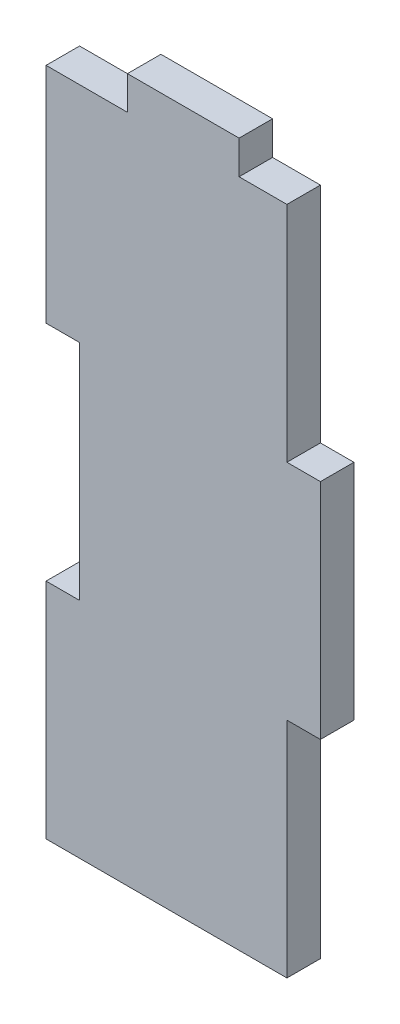
ISO-10303-21;
HEADER;
FILE_DESCRIPTION(('STEP AP214'),'2;1');
FILE_NAME('part.step','',(''),(''),'','','');
FILE_SCHEMA(('AUTOMOTIVE_DESIGN { 1 0 10303 214 1 1 1 1 }'));
ENDSEC;
DATA;
#1=APPLICATION_CONTEXT('core data for automotive mechanical design processes');
#2=APPLICATION_PROTOCOL_DEFINITION('international standard','automotive_design',2000,#1);
#3=PRODUCT_CONTEXT('',#1,'mechanical');
#4=PRODUCT('Part','Part','',(#3));
#5=PRODUCT_RELATED_PRODUCT_CATEGORY('part','',(#4));
#6=PRODUCT_DEFINITION_FORMATION('','',#4);
#7=PRODUCT_DEFINITION_CONTEXT('part definition',#1,'design');
#8=PRODUCT_DEFINITION('design','',#6,#7);
#9=PRODUCT_DEFINITION_SHAPE('','',#8);
#10=(LENGTH_UNIT() NAMED_UNIT(*) SI_UNIT(.MILLI.,.METRE.));
#11=(NAMED_UNIT(*) PLANE_ANGLE_UNIT() SI_UNIT($,.RADIAN.));
#12=(NAMED_UNIT(*) SI_UNIT($,.STERADIAN.) SOLID_ANGLE_UNIT());
#13=UNCERTAINTY_MEASURE_WITH_UNIT(LENGTH_MEASURE(1.E-05),#10,'distance_accuracy_value','');
#14=(GEOMETRIC_REPRESENTATION_CONTEXT(3) GLOBAL_UNCERTAINTY_ASSIGNED_CONTEXT((#13)) GLOBAL_UNIT_ASSIGNED_CONTEXT((#10,
#11,#12)) REPRESENTATION_CONTEXT('',''));
#15=CARTESIAN_POINT('',(0.,0.,0.));
#16=DIRECTION('',(0.,0.,1.));
#17=DIRECTION('',(1.,0.,0.));
#18=AXIS2_PLACEMENT_3D('',#15,#16,#17);
#19=CARTESIAN_POINT('',(13.785,60.,3.));
#20=DIRECTION('',(0.,-1.,0.));
#21=DIRECTION('',(0.,0.,-1.));
#22=AXIS2_PLACEMENT_3D('',#19,#20,#21);
#23=PLANE('',#22);
#24=DIRECTION('',(0.,0.,1.));
#25=VECTOR('',#24,1.);
#26=CARTESIAN_POINT('',(17.285,60.,-4.60977222864645));
#27=LINE('',#26,#25);
#28=CARTESIAN_POINT('',(17.285,60.,0.));
#29=VERTEX_POINT('',#28);
#30=CARTESIAN_POINT('',(17.285,60.,3.));
#31=VERTEX_POINT('',#30);
#32=EDGE_CURVE('E69',#29,#31,#27,.T.);
#33=ORIENTED_EDGE('',*,*,#32,.T.);
#34=DIRECTION('',(-1.,0.,0.));
#35=VECTOR('',#34,1.);
#36=CARTESIAN_POINT('',(13.785,60.,3.));
#37=LINE('',#36,#35);
#38=CARTESIAN_POINT('',(21.57,60.,3.));
#39=VERTEX_POINT('',#38);
#40=EDGE_CURVE('E171',#39,#31,#37,.T.);
#41=ORIENTED_EDGE('',*,*,#40,.F.);
#42=DIRECTION('',(0.,0.,-1.));
#43=VECTOR('',#42,1.);
#44=CARTESIAN_POINT('',(21.57,60.,3.));
#45=LINE('',#44,#43);
#46=CARTESIAN_POINT('',(21.57,60.,0.));
#47=VERTEX_POINT('',#46);
#48=EDGE_CURVE('E311',#39,#47,#45,.T.);
#49=ORIENTED_EDGE('',*,*,#48,.T.);
#50=DIRECTION('',(-1.,0.,0.));
#51=VECTOR('',#50,1.);
#52=CARTESIAN_POINT('',(13.785,60.,0.));
#53=LINE('',#52,#51);
#54=EDGE_CURVE('E259',#47,#29,#53,.T.);
#55=ORIENTED_EDGE('',*,*,#54,.T.);
#56=EDGE_LOOP('',(#33,#41,#49,#55));
#57=FACE_BOUND('',#56,.T.);
#58=ADVANCED_FACE('F45',(#57),#23,.F.);
#59=CARTESIAN_POINT('',(21.57,20.,3.));
#60=DIRECTION('',(-1.,0.,0.));
#61=DIRECTION('',(0.,0.,1.));
#62=AXIS2_PLACEMENT_3D('',#59,#60,#61);
#63=PLANE('',#62);
#64=DIRECTION('',(0.,1.,0.));
#65=VECTOR('',#64,1.);
#66=CARTESIAN_POINT('',(21.57,20.,0.));
#67=LINE('',#66,#65);
#68=CARTESIAN_POINT('',(21.57,0.,0.));
#69=VERTEX_POINT('',#68);
#70=CARTESIAN_POINT('',(21.57,20.,0.));
#71=VERTEX_POINT('',#70);
#72=EDGE_CURVE('E181',#69,#71,#67,.T.);
#73=ORIENTED_EDGE('',*,*,#72,.T.);
#74=DIRECTION('',(0.,0.,-1.));
#75=VECTOR('',#74,1.);
#76=CARTESIAN_POINT('',(21.57,20.,3.));
#77=LINE('',#76,#75);
#78=CARTESIAN_POINT('',(21.57,20.,3.));
#79=VERTEX_POINT('',#78);
#80=EDGE_CURVE('E11',#79,#71,#77,.T.);
#81=ORIENTED_EDGE('',*,*,#80,.F.);
#82=DIRECTION('',(0.,1.,0.));
#83=VECTOR('',#82,1.);
#84=CARTESIAN_POINT('',(21.57,20.,3.));
#85=LINE('',#84,#83);
#86=CARTESIAN_POINT('',(21.57,0.,3.));
#87=VERTEX_POINT('',#86);
#88=EDGE_CURVE('E204',#87,#79,#85,.T.);
#89=ORIENTED_EDGE('',*,*,#88,.F.);
#90=DIRECTION('',(0.,0.,-1.));
#91=VECTOR('',#90,1.);
#92=CARTESIAN_POINT('',(21.57,0.,3.));
#93=LINE('',#92,#91);
#94=EDGE_CURVE('E243',#87,#69,#93,.T.);
#95=ORIENTED_EDGE('',*,*,#94,.T.);
#96=EDGE_LOOP('',(#73,#81,#89,#95));
#97=FACE_BOUND('',#96,.T.);
#98=ADVANCED_FACE('F47',(#97),#63,.F.);
#99=CARTESIAN_POINT('',(24.57,20.,3.));
#100=DIRECTION('',(0.,1.,0.));
#101=DIRECTION('',(0.,0.,1.));
#102=AXIS2_PLACEMENT_3D('',#99,#100,#101);
#103=PLANE('',#102);
#104=DIRECTION('',(1.,0.,0.));
#105=VECTOR('',#104,1.);
#106=CARTESIAN_POINT('',(24.57,20.,0.));
#107=LINE('',#106,#105);
#108=CARTESIAN_POINT('',(24.57,20.,0.));
#109=VERTEX_POINT('',#108);
#110=EDGE_CURVE('E247',#71,#109,#107,.T.);
#111=ORIENTED_EDGE('',*,*,#110,.T.);
#112=DIRECTION('',(0.,0.,-1.));
#113=VECTOR('',#112,1.);
#114=CARTESIAN_POINT('',(24.57,20.,3.));
#115=LINE('',#114,#113);
#116=CARTESIAN_POINT('',(24.57,20.,3.));
#117=VERTEX_POINT('',#116);
#118=EDGE_CURVE('E54',#117,#109,#115,.T.);
#119=ORIENTED_EDGE('',*,*,#118,.F.);
#120=DIRECTION('',(1.,0.,0.));
#121=VECTOR('',#120,1.);
#122=CARTESIAN_POINT('',(24.57,20.,3.));
#123=LINE('',#122,#121);
#124=EDGE_CURVE('E208',#79,#117,#123,.T.);
#125=ORIENTED_EDGE('',*,*,#124,.F.);
#126=ORIENTED_EDGE('',*,*,#80,.T.);
#127=EDGE_LOOP('',(#111,#119,#125,#126));
#128=FACE_BOUND('',#127,.T.);
#129=ADVANCED_FACE('F348',(#128),#103,.F.);
#130=CARTESIAN_POINT('',(24.57,40.,3.));
#131=DIRECTION('',(-1.,0.,0.));
#132=DIRECTION('',(0.,0.,1.));
#133=AXIS2_PLACEMENT_3D('',#130,#131,#132);
#134=PLANE('',#133);
#135=DIRECTION('',(0.,1.,0.));
#136=VECTOR('',#135,1.);
#137=CARTESIAN_POINT('',(24.57,40.,0.));
#138=LINE('',#137,#136);
#139=CARTESIAN_POINT('',(24.57,40.,0.));
#140=VERTEX_POINT('',#139);
#141=EDGE_CURVE('E250',#109,#140,#138,.T.);
#142=ORIENTED_EDGE('',*,*,#141,.T.);
#143=DIRECTION('',(0.,0.,-1.));
#144=VECTOR('',#143,1.);
#145=CARTESIAN_POINT('',(24.57,40.,3.));
#146=LINE('',#145,#144);
#147=CARTESIAN_POINT('',(24.57,40.,3.));
#148=VERTEX_POINT('',#147);
#149=EDGE_CURVE('E319',#148,#140,#146,.T.);
#150=ORIENTED_EDGE('',*,*,#149,.F.);
#151=DIRECTION('',(0.,1.,0.));
#152=VECTOR('',#151,1.);
#153=CARTESIAN_POINT('',(24.57,40.,3.));
#154=LINE('',#153,#152);
#155=EDGE_CURVE('E212',#117,#148,#154,.T.);
#156=ORIENTED_EDGE('',*,*,#155,.F.);
#157=ORIENTED_EDGE('',*,*,#118,.T.);
#158=EDGE_LOOP('',(#142,#150,#156,#157));
#159=FACE_BOUND('',#158,.T.);
#160=ADVANCED_FACE('F328',(#159),#134,.F.);
#161=CARTESIAN_POINT('',(21.57,40.,3.));
#162=DIRECTION('',(0.,-1.,0.));
#163=DIRECTION('',(0.,0.,-1.));
#164=AXIS2_PLACEMENT_3D('',#161,#162,#163);
#165=PLANE('',#164);
#166=DIRECTION('',(-1.,0.,0.));
#167=VECTOR('',#166,1.);
#168=CARTESIAN_POINT('',(21.57,40.,0.));
#169=LINE('',#168,#167);
#170=CARTESIAN_POINT('',(21.57,40.,0.));
#171=VERTEX_POINT('',#170);
#172=EDGE_CURVE('E253',#140,#171,#169,.T.);
#173=ORIENTED_EDGE('',*,*,#172,.T.);
#174=DIRECTION('',(0.,0.,-1.));
#175=VECTOR('',#174,1.);
#176=CARTESIAN_POINT('',(21.57,40.,3.));
#177=LINE('',#176,#175);
#178=CARTESIAN_POINT('',(21.57,40.,3.));
#179=VERTEX_POINT('',#178);
#180=EDGE_CURVE('E315',#179,#171,#177,.T.);
#181=ORIENTED_EDGE('',*,*,#180,.F.);
#182=DIRECTION('',(-1.,0.,0.));
#183=VECTOR('',#182,1.);
#184=CARTESIAN_POINT('',(21.57,40.,3.));
#185=LINE('',#184,#183);
#186=EDGE_CURVE('E215',#148,#179,#185,.T.);
#187=ORIENTED_EDGE('',*,*,#186,.F.);
#188=ORIENTED_EDGE('',*,*,#149,.T.);
#189=EDGE_LOOP('',(#173,#181,#187,#188));
#190=FACE_BOUND('',#189,.T.);
#191=ADVANCED_FACE('F340',(#190),#165,.F.);
#192=CARTESIAN_POINT('',(21.57,60.,3.));
#193=DIRECTION('',(-1.,0.,0.));
#194=DIRECTION('',(0.,0.,1.));
#195=AXIS2_PLACEMENT_3D('',#192,#193,#194);
#196=PLANE('',#195);
#197=DIRECTION('',(0.,1.,0.));
#198=VECTOR('',#197,1.);
#199=CARTESIAN_POINT('',(21.57,60.,0.));
#200=LINE('',#199,#198);
#201=EDGE_CURVE('E256',#171,#47,#200,.T.);
#202=ORIENTED_EDGE('',*,*,#201,.T.);
#203=ORIENTED_EDGE('',*,*,#48,.F.);
#204=DIRECTION('',(0.,1.,0.));
#205=VECTOR('',#204,1.);
#206=CARTESIAN_POINT('',(21.57,60.,3.));
#207=LINE('',#206,#205);
#208=EDGE_CURVE('E218',#179,#39,#207,.T.);
#209=ORIENTED_EDGE('',*,*,#208,.F.);
#210=ORIENTED_EDGE('',*,*,#180,.T.);
#211=EDGE_LOOP('',(#202,#203,#209,#210));
#212=FACE_BOUND('',#211,.T.);
#213=ADVANCED_FACE('F344',(#212),#196,.F.);
#214=CARTESIAN_POINT('',(10.785,63.,3.));
#215=DIRECTION('',(0.,-1.,0.));
#216=DIRECTION('',(0.,0.,-1.));
#217=AXIS2_PLACEMENT_3D('',#214,#215,#216);
#218=PLANE('',#217);
#219=DIRECTION('',(-1.,0.,0.));
#220=VECTOR('',#219,1.);
#221=CARTESIAN_POINT('',(10.785,63.,0.));
#222=LINE('',#221,#220);
#223=CARTESIAN_POINT('',(17.285,63.,0.));
#224=VERTEX_POINT('',#223);
#225=CARTESIAN_POINT('',(7.285,63.,0.));
#226=VERTEX_POINT('',#225);
#227=EDGE_CURVE('E176',#224,#226,#222,.T.);
#228=ORIENTED_EDGE('',*,*,#227,.T.);
#229=DIRECTION('',(0.,0.,1.));
#230=VECTOR('',#229,1.);
#231=CARTESIAN_POINT('',(7.285,63.,-4.60977222864645));
#232=LINE('',#231,#230);
#233=CARTESIAN_POINT('',(7.285,63.,3.));
#234=VERTEX_POINT('',#233);
#235=EDGE_CURVE('E174',#226,#234,#232,.T.);
#236=ORIENTED_EDGE('',*,*,#235,.T.);
#237=DIRECTION('',(-1.,0.,0.));
#238=VECTOR('',#237,1.);
#239=CARTESIAN_POINT('',(10.785,63.,3.));
#240=LINE('',#239,#238);
#241=CARTESIAN_POINT('',(17.285,63.,3.));
#242=VERTEX_POINT('',#241);
#243=EDGE_CURVE('E160',#242,#234,#240,.T.);
#244=ORIENTED_EDGE('',*,*,#243,.F.);
#245=DIRECTION('',(0.,0.,1.));
#246=VECTOR('',#245,1.);
#247=CARTESIAN_POINT('',(17.285,63.,-4.60977222864645));
#248=LINE('',#247,#246);
#249=EDGE_CURVE('E198',#224,#242,#248,.T.);
#250=ORIENTED_EDGE('',*,*,#249,.F.);
#251=EDGE_LOOP('',(#228,#236,#244,#250));
#252=FACE_BOUND('',#251,.T.);
#253=ADVANCED_FACE('F175',(#252),#218,.F.);
#254=CARTESIAN_POINT('',(0.,60.,3.));
#255=DIRECTION('',(0.,-1.,0.));
#256=DIRECTION('',(0.,0.,-1.));
#257=AXIS2_PLACEMENT_3D('',#254,#255,#256);
#258=PLANE('',#257);
#259=DIRECTION('',(-1.,0.,0.));
#260=VECTOR('',#259,1.);
#261=CARTESIAN_POINT('',(0.,60.,3.));
#262=LINE('',#261,#260);
#263=CARTESIAN_POINT('',(7.285,60.,3.));
#264=VERTEX_POINT('',#263);
#265=CARTESIAN_POINT('',(0.,60.,3.));
#266=VERTEX_POINT('',#265);
#267=EDGE_CURVE('E61',#264,#266,#262,.T.);
#268=ORIENTED_EDGE('',*,*,#267,.F.);
#269=DIRECTION('',(0.,0.,1.));
#270=VECTOR('',#269,1.);
#271=CARTESIAN_POINT('',(7.285,60.,-4.60977222864645));
#272=LINE('',#271,#270);
#273=CARTESIAN_POINT('',(7.285,60.,0.));
#274=VERTEX_POINT('',#273);
#275=EDGE_CURVE('E182',#274,#264,#272,.T.);
#276=ORIENTED_EDGE('',*,*,#275,.F.);
#277=DIRECTION('',(-1.,0.,0.));
#278=VECTOR('',#277,1.);
#279=CARTESIAN_POINT('',(0.,60.,0.));
#280=LINE('',#279,#278);
#281=CARTESIAN_POINT('',(0.,60.,0.));
#282=VERTEX_POINT('',#281);
#283=EDGE_CURVE('E264',#274,#282,#280,.T.);
#284=ORIENTED_EDGE('',*,*,#283,.T.);
#285=DIRECTION('',(0.,0.,-1.));
#286=VECTOR('',#285,1.);
#287=CARTESIAN_POINT('',(0.,60.,3.));
#288=LINE('',#287,#286);
#289=EDGE_CURVE('E307',#266,#282,#288,.T.);
#290=ORIENTED_EDGE('',*,*,#289,.F.);
#291=EDGE_LOOP('',(#268,#276,#284,#290));
#292=FACE_BOUND('',#291,.T.);
#293=ADVANCED_FACE('F380',(#292),#258,.F.);
#294=CARTESIAN_POINT('',(0.,40.,3.));
#295=DIRECTION('',(1.,0.,0.));
#296=DIRECTION('',(0.,0.,-1.));
#297=AXIS2_PLACEMENT_3D('',#294,#295,#296);
#298=PLANE('',#297);
#299=DIRECTION('',(0.,-1.,0.));
#300=VECTOR('',#299,1.);
#301=CARTESIAN_POINT('',(0.,40.,0.));
#302=LINE('',#301,#300);
#303=CARTESIAN_POINT('',(0.,40.,0.));
#304=VERTEX_POINT('',#303);
#305=EDGE_CURVE('E267',#282,#304,#302,.T.);
#306=ORIENTED_EDGE('',*,*,#305,.T.);
#307=DIRECTION('',(0.,0.,-1.));
#308=VECTOR('',#307,1.);
#309=CARTESIAN_POINT('',(0.,40.,3.));
#310=LINE('',#309,#308);
#311=CARTESIAN_POINT('',(0.,40.,3.));
#312=VERTEX_POINT('',#311);
#313=EDGE_CURVE('E303',#312,#304,#310,.T.);
#314=ORIENTED_EDGE('',*,*,#313,.F.);
#315=DIRECTION('',(0.,-1.,0.));
#316=VECTOR('',#315,1.);
#317=CARTESIAN_POINT('',(0.,40.,3.));
#318=LINE('',#317,#316);
#319=EDGE_CURVE('E225',#266,#312,#318,.T.);
#320=ORIENTED_EDGE('',*,*,#319,.F.);
#321=ORIENTED_EDGE('',*,*,#289,.T.);
#322=EDGE_LOOP('',(#306,#314,#320,#321));
#323=FACE_BOUND('',#322,.T.);
#324=ADVANCED_FACE('F379',(#323),#298,.F.);
#325=CARTESIAN_POINT('',(3.,40.,3.));
#326=DIRECTION('',(0.,1.,0.));
#327=DIRECTION('',(0.,0.,1.));
#328=AXIS2_PLACEMENT_3D('',#325,#326,#327);
#329=PLANE('',#328);
#330=DIRECTION('',(1.,0.,0.));
#331=VECTOR('',#330,1.);
#332=CARTESIAN_POINT('',(3.,40.,0.));
#333=LINE('',#332,#331);
#334=CARTESIAN_POINT('',(3.,40.,0.));
#335=VERTEX_POINT('',#334);
#336=EDGE_CURVE('E270',#304,#335,#333,.T.);
#337=ORIENTED_EDGE('',*,*,#336,.T.);
#338=DIRECTION('',(0.,0.,-1.));
#339=VECTOR('',#338,1.);
#340=CARTESIAN_POINT('',(3.,40.,3.));
#341=LINE('',#340,#339);
#342=CARTESIAN_POINT('',(3.,40.,3.));
#343=VERTEX_POINT('',#342);
#344=EDGE_CURVE('E299',#343,#335,#341,.T.);
#345=ORIENTED_EDGE('',*,*,#344,.F.);
#346=DIRECTION('',(1.,0.,0.));
#347=VECTOR('',#346,1.);
#348=CARTESIAN_POINT('',(3.,40.,3.));
#349=LINE('',#348,#347);
#350=EDGE_CURVE('E228',#312,#343,#349,.T.);
#351=ORIENTED_EDGE('',*,*,#350,.F.);
#352=ORIENTED_EDGE('',*,*,#313,.T.);
#353=EDGE_LOOP('',(#337,#345,#351,#352));
#354=FACE_BOUND('',#353,.T.);
#355=ADVANCED_FACE('F375',(#354),#329,.F.);
#356=CARTESIAN_POINT('',(3.,20.,3.));
#357=DIRECTION('',(1.,0.,0.));
#358=DIRECTION('',(0.,0.,-1.));
#359=AXIS2_PLACEMENT_3D('',#356,#357,#358);
#360=PLANE('',#359);
#361=DIRECTION('',(0.,-1.,0.));
#362=VECTOR('',#361,1.);
#363=CARTESIAN_POINT('',(3.,20.,0.));
#364=LINE('',#363,#362);
#365=CARTESIAN_POINT('',(3.,20.,0.));
#366=VERTEX_POINT('',#365);
#367=EDGE_CURVE('E273',#335,#366,#364,.T.);
#368=ORIENTED_EDGE('',*,*,#367,.T.);
#369=DIRECTION('',(0.,0.,-1.));
#370=VECTOR('',#369,1.);
#371=CARTESIAN_POINT('',(3.,20.,3.));
#372=LINE('',#371,#370);
#373=CARTESIAN_POINT('',(3.,20.,3.));
#374=VERTEX_POINT('',#373);
#375=EDGE_CURVE('E295',#374,#366,#372,.T.);
#376=ORIENTED_EDGE('',*,*,#375,.F.);
#377=DIRECTION('',(0.,-1.,0.));
#378=VECTOR('',#377,1.);
#379=CARTESIAN_POINT('',(3.,20.,3.));
#380=LINE('',#379,#378);
#381=EDGE_CURVE('E231',#343,#374,#380,.T.);
#382=ORIENTED_EDGE('',*,*,#381,.F.);
#383=ORIENTED_EDGE('',*,*,#344,.T.);
#384=EDGE_LOOP('',(#368,#376,#382,#383));
#385=FACE_BOUND('',#384,.T.);
#386=ADVANCED_FACE('F370',(#385),#360,.F.);
#387=CARTESIAN_POINT('',(0.,20.,3.));
#388=DIRECTION('',(0.,-1.,0.));
#389=DIRECTION('',(0.,0.,-1.));
#390=AXIS2_PLACEMENT_3D('',#387,#388,#389);
#391=PLANE('',#390);
#392=DIRECTION('',(-1.,0.,0.));
#393=VECTOR('',#392,1.);
#394=CARTESIAN_POINT('',(0.,20.,0.));
#395=LINE('',#394,#393);
#396=CARTESIAN_POINT('',(0.,20.,0.));
#397=VERTEX_POINT('',#396);
#398=EDGE_CURVE('E276',#366,#397,#395,.T.);
#399=ORIENTED_EDGE('',*,*,#398,.T.);
#400=DIRECTION('',(0.,0.,-1.));
#401=VECTOR('',#400,1.);
#402=CARTESIAN_POINT('',(0.,20.,3.));
#403=LINE('',#402,#401);
#404=CARTESIAN_POINT('',(0.,20.,3.));
#405=VERTEX_POINT('',#404);
#406=EDGE_CURVE('E291',#405,#397,#403,.T.);
#407=ORIENTED_EDGE('',*,*,#406,.F.);
#408=DIRECTION('',(-1.,0.,0.));
#409=VECTOR('',#408,1.);
#410=CARTESIAN_POINT('',(0.,20.,3.));
#411=LINE('',#410,#409);
#412=EDGE_CURVE('E234',#374,#405,#411,.T.);
#413=ORIENTED_EDGE('',*,*,#412,.F.);
#414=ORIENTED_EDGE('',*,*,#375,.T.);
#415=EDGE_LOOP('',(#399,#407,#413,#414));
#416=FACE_BOUND('',#415,.T.);
#417=ADVANCED_FACE('F364',(#416),#391,.F.);
#418=CARTESIAN_POINT('',(0.,0.,3.));
#419=DIRECTION('',(1.,0.,0.));
#420=DIRECTION('',(0.,0.,-1.));
#421=AXIS2_PLACEMENT_3D('',#418,#419,#420);
#422=PLANE('',#421);
#423=DIRECTION('',(0.,-1.,0.));
#424=VECTOR('',#423,1.);
#425=CARTESIAN_POINT('',(0.,0.,0.));
#426=LINE('',#425,#424);
#427=CARTESIAN_POINT('',(0.,0.,0.));
#428=VERTEX_POINT('',#427);
#429=EDGE_CURVE('E279',#397,#428,#426,.T.);
#430=ORIENTED_EDGE('',*,*,#429,.T.);
#431=DIRECTION('',(0.,0.,-1.));
#432=VECTOR('',#431,1.);
#433=CARTESIAN_POINT('',(0.,0.,3.));
#434=LINE('',#433,#432);
#435=CARTESIAN_POINT('',(0.,0.,3.));
#436=VERTEX_POINT('',#435);
#437=EDGE_CURVE('E287',#436,#428,#434,.T.);
#438=ORIENTED_EDGE('',*,*,#437,.F.);
#439=DIRECTION('',(0.,-1.,0.));
#440=VECTOR('',#439,1.);
#441=CARTESIAN_POINT('',(0.,0.,3.));
#442=LINE('',#441,#440);
#443=EDGE_CURVE('E237',#405,#436,#442,.T.);
#444=ORIENTED_EDGE('',*,*,#443,.F.);
#445=ORIENTED_EDGE('',*,*,#406,.T.);
#446=EDGE_LOOP('',(#430,#438,#444,#445));
#447=FACE_BOUND('',#446,.T.);
#448=ADVANCED_FACE('F360',(#447),#422,.F.);
#449=CARTESIAN_POINT('',(21.57,0.,3.));
#450=DIRECTION('',(0.,1.,0.));
#451=DIRECTION('',(0.,0.,1.));
#452=AXIS2_PLACEMENT_3D('',#449,#450,#451);
#453=PLANE('',#452);
#454=DIRECTION('',(1.,0.,0.));
#455=VECTOR('',#454,1.);
#456=CARTESIAN_POINT('',(21.57,0.,0.));
#457=LINE('',#456,#455);
#458=EDGE_CURVE('E209',#428,#69,#457,.T.);
#459=ORIENTED_EDGE('',*,*,#458,.T.);
#460=ORIENTED_EDGE('',*,*,#94,.F.);
#461=DIRECTION('',(1.,0.,0.));
#462=VECTOR('',#461,1.);
#463=CARTESIAN_POINT('',(21.57,0.,3.));
#464=LINE('',#463,#462);
#465=EDGE_CURVE('E240',#436,#87,#464,.T.);
#466=ORIENTED_EDGE('',*,*,#465,.F.);
#467=ORIENTED_EDGE('',*,*,#437,.T.);
#468=EDGE_LOOP('',(#459,#460,#466,#467));
#469=FACE_BOUND('',#468,.T.);
#470=ADVANCED_FACE('F355',(#469),#453,.F.);
#471=CARTESIAN_POINT('',(0.,0.,3.));
#472=DIRECTION('',(0.,0.,-1.));
#473=DIRECTION('',(-1.,0.,0.));
#474=AXIS2_PLACEMENT_3D('',#471,#472,#473);
#475=PLANE('',#474);
#476=DIRECTION('',(0.,-1.,0.));
#477=VECTOR('',#476,1.);
#478=CARTESIAN_POINT('',(7.285,0.,3.));
#479=LINE('',#478,#477);
#480=EDGE_CURVE('E164',#234,#264,#479,.T.);
#481=ORIENTED_EDGE('',*,*,#480,.T.);
#482=ORIENTED_EDGE('',*,*,#267,.T.);
#483=ORIENTED_EDGE('',*,*,#319,.T.);
#484=ORIENTED_EDGE('',*,*,#350,.T.);
#485=ORIENTED_EDGE('',*,*,#381,.T.);
#486=ORIENTED_EDGE('',*,*,#412,.T.);
#487=ORIENTED_EDGE('',*,*,#443,.T.);
#488=ORIENTED_EDGE('',*,*,#465,.T.);
#489=ORIENTED_EDGE('',*,*,#88,.T.);
#490=ORIENTED_EDGE('',*,*,#124,.T.);
#491=ORIENTED_EDGE('',*,*,#155,.T.);
#492=ORIENTED_EDGE('',*,*,#186,.T.);
#493=ORIENTED_EDGE('',*,*,#208,.T.);
#494=ORIENTED_EDGE('',*,*,#40,.T.);
#495=DIRECTION('',(0.,-1.,0.));
#496=VECTOR('',#495,1.);
#497=CARTESIAN_POINT('',(17.285,0.,3.));
#498=LINE('',#497,#496);
#499=EDGE_CURVE('E166',#242,#31,#498,.T.);
#500=ORIENTED_EDGE('',*,*,#499,.F.);
#501=ORIENTED_EDGE('',*,*,#243,.T.);
#502=EDGE_LOOP('',(#481,#482,#483,#484,#485,#486,#487,#488,#489,#490,#491,#492,#493,#494,#500,#501));
#503=FACE_BOUND('',#502,.T.);
#504=ADVANCED_FACE('F162',(#503),#475,.F.);
#505=CARTESIAN_POINT('',(0.,0.,0.));
#506=DIRECTION('',(0.,0.,-1.));
#507=DIRECTION('',(-1.,0.,0.));
#508=AXIS2_PLACEMENT_3D('',#505,#506,#507);
#509=PLANE('',#508);
#510=ORIENTED_EDGE('',*,*,#283,.F.);
#511=DIRECTION('',(0.,-1.,0.));
#512=VECTOR('',#511,1.);
#513=CARTESIAN_POINT('',(7.285,0.,0.));
#514=LINE('',#513,#512);
#515=EDGE_CURVE('E186',#226,#274,#514,.T.);
#516=ORIENTED_EDGE('',*,*,#515,.F.);
#517=ORIENTED_EDGE('',*,*,#227,.F.);
#518=DIRECTION('',(0.,-1.,0.));
#519=VECTOR('',#518,1.);
#520=CARTESIAN_POINT('',(17.285,0.,0.));
#521=LINE('',#520,#519);
#522=EDGE_CURVE('E187',#224,#29,#521,.T.);
#523=ORIENTED_EDGE('',*,*,#522,.T.);
#524=ORIENTED_EDGE('',*,*,#54,.F.);
#525=ORIENTED_EDGE('',*,*,#201,.F.);
#526=ORIENTED_EDGE('',*,*,#172,.F.);
#527=ORIENTED_EDGE('',*,*,#141,.F.);
#528=ORIENTED_EDGE('',*,*,#110,.F.);
#529=ORIENTED_EDGE('',*,*,#72,.F.);
#530=ORIENTED_EDGE('',*,*,#458,.F.);
#531=ORIENTED_EDGE('',*,*,#429,.F.);
#532=ORIENTED_EDGE('',*,*,#398,.F.);
#533=ORIENTED_EDGE('',*,*,#367,.F.);
#534=ORIENTED_EDGE('',*,*,#336,.F.);
#535=ORIENTED_EDGE('',*,*,#305,.F.);
#536=EDGE_LOOP('',(#510,#516,#517,#523,#524,#525,#526,#527,#528,#529,#530,#531,#532,#533,#534,#535));
#537=FACE_BOUND('',#536,.T.);
#538=ADVANCED_FACE('F334',(#537),#509,.T.);
#539=CARTESIAN_POINT('',(17.285,0.,-4.60977222864645));
#540=DIRECTION('',(-1.,0.,0.));
#541=DIRECTION('',(0.,0.,1.));
#542=AXIS2_PLACEMENT_3D('',#539,#540,#541);
#543=PLANE('',#542);
#544=ORIENTED_EDGE('',*,*,#522,.F.);
#545=ORIENTED_EDGE('',*,*,#249,.T.);
#546=ORIENTED_EDGE('',*,*,#499,.T.);
#547=ORIENTED_EDGE('',*,*,#32,.F.);
#548=EDGE_LOOP('',(#544,#545,#546,#547));
#549=FACE_BOUND('',#548,.T.);
#550=ADVANCED_FACE('F484',(#549),#543,.F.);
#551=CARTESIAN_POINT('',(7.285,0.,-4.60977222864645));
#552=DIRECTION('',(-1.,0.,0.));
#553=DIRECTION('',(0.,0.,1.));
#554=AXIS2_PLACEMENT_3D('',#551,#552,#553);
#555=PLANE('',#554);
#556=ORIENTED_EDGE('',*,*,#235,.F.);
#557=ORIENTED_EDGE('',*,*,#515,.T.);
#558=ORIENTED_EDGE('',*,*,#275,.T.);
#559=ORIENTED_EDGE('',*,*,#480,.F.);
#560=EDGE_LOOP('',(#556,#557,#558,#559));
#561=FACE_BOUND('',#560,.T.);
#562=ADVANCED_FACE('F184',(#561),#555,.T.);
#563=CLOSED_SHELL('',(#58,#98,#129,#160,#191,#213,#253,#293,#324,#355,#386,#417,#448,#470,#504,
#538,#550,#562));
#564=MANIFOLD_SOLID_BREP('B2',#563);
#565=ADVANCED_BREP_SHAPE_REPRESENTATION('',(#18,#564),#14);
#566=SHAPE_DEFINITION_REPRESENTATION(#9,#565);
ENDSEC;
END-ISO-10303-21;
